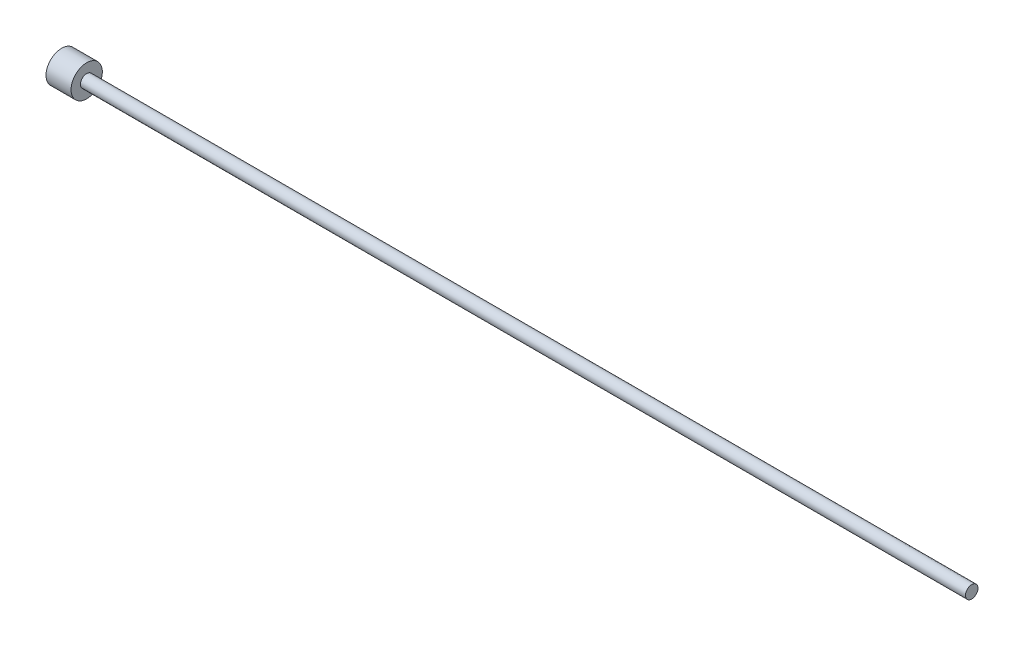
ISO-10303-21;
HEADER;
FILE_DESCRIPTION(('STEP AP214'),'2;1');
FILE_NAME('part.step','',(''),(''),'','','');
FILE_SCHEMA(('AUTOMOTIVE_DESIGN { 1 0 10303 214 1 1 1 1 }'));
ENDSEC;
DATA;
#1=APPLICATION_CONTEXT('core data for automotive mechanical design processes');
#2=APPLICATION_PROTOCOL_DEFINITION('international standard','automotive_design',2000,#1);
#3=PRODUCT_CONTEXT('',#1,'mechanical');
#4=PRODUCT('Part','Part','',(#3));
#5=PRODUCT_RELATED_PRODUCT_CATEGORY('part','',(#4));
#6=PRODUCT_DEFINITION_FORMATION('','',#4);
#7=PRODUCT_DEFINITION_CONTEXT('part definition',#1,'design');
#8=PRODUCT_DEFINITION('design','',#6,#7);
#9=PRODUCT_DEFINITION_SHAPE('','',#8);
#10=(LENGTH_UNIT() NAMED_UNIT(*) SI_UNIT(.MILLI.,.METRE.));
#11=(NAMED_UNIT(*) PLANE_ANGLE_UNIT() SI_UNIT($,.RADIAN.));
#12=(NAMED_UNIT(*) SI_UNIT($,.STERADIAN.) SOLID_ANGLE_UNIT());
#13=UNCERTAINTY_MEASURE_WITH_UNIT(LENGTH_MEASURE(1.E-05),#10,'distance_accuracy_value','');
#14=(GEOMETRIC_REPRESENTATION_CONTEXT(3) GLOBAL_UNCERTAINTY_ASSIGNED_CONTEXT((#13)) GLOBAL_UNIT_ASSIGNED_CONTEXT((#10,
#11,#12)) REPRESENTATION_CONTEXT('',''));
#15=CARTESIAN_POINT('',(0.,0.,0.));
#16=DIRECTION('',(0.,0.,1.));
#17=DIRECTION('',(1.,0.,0.));
#18=AXIS2_PLACEMENT_3D('',#15,#16,#17);
#19=CARTESIAN_POINT('',(0.,0.,0.));
#20=DIRECTION('',(1.,0.,0.));
#21=DIRECTION('',(0.,0.,-1.));
#22=AXIS2_PLACEMENT_3D('',#19,#20,#21);
#23=PLANE('',#22);
#24=CARTESIAN_POINT('',(0.,0.,0.));
#25=DIRECTION('',(-1.,0.,0.));
#26=DIRECTION('',(0.,0.,1.));
#27=AXIS2_PLACEMENT_3D('',#24,#25,#26);
#28=CIRCLE('',#27,12.5);
#29=CARTESIAN_POINT('',(0.,0.,12.5));
#30=VERTEX_POINT('',#29);
#31=EDGE_CURVE('E10',#30,#30,#28,.T.);
#32=ORIENTED_EDGE('',*,*,#31,.T.);
#33=EDGE_LOOP('',(#32));
#34=FACE_BOUND('',#33,.T.);
#35=ADVANCED_FACE('F30',(#34),#23,.F.);
#36=CARTESIAN_POINT('',(0.,0.,0.));
#37=DIRECTION('',(-1.,0.,0.));
#38=DIRECTION('',(0.,0.,1.));
#39=AXIS2_PLACEMENT_3D('',#36,#37,#38);
#40=CYLINDRICAL_SURFACE('',#39,12.5);
#41=ORIENTED_EDGE('',*,*,#31,.F.);
#42=EDGE_LOOP('',(#41));
#43=FACE_BOUND('',#42,.T.);
#44=CARTESIAN_POINT('',(20.,0.,0.));
#45=DIRECTION('',(-1.,0.,0.));
#46=DIRECTION('',(0.,0.,1.));
#47=AXIS2_PLACEMENT_3D('',#44,#45,#46);
#48=CIRCLE('',#47,12.5);
#49=CARTESIAN_POINT('',(20.,0.,12.5));
#50=VERTEX_POINT('',#49);
#51=EDGE_CURVE('E36',#50,#50,#48,.T.);
#52=ORIENTED_EDGE('',*,*,#51,.T.);
#53=EDGE_LOOP('',(#52));
#54=FACE_BOUND('',#53,.T.);
#55=ADVANCED_FACE('F62',(#43,#54),#40,.T.);
#56=CARTESIAN_POINT('',(20.,0.,-12.5));
#57=DIRECTION('',(-1.,0.,0.));
#58=DIRECTION('',(0.,0.,1.));
#59=AXIS2_PLACEMENT_3D('',#56,#57,#58);
#60=PLANE('',#59);
#61=ORIENTED_EDGE('',*,*,#51,.F.);
#62=EDGE_LOOP('',(#61));
#63=FACE_BOUND('',#62,.T.);
#64=CARTESIAN_POINT('',(20.,0.,0.));
#65=DIRECTION('',(-1.,0.,0.));
#66=DIRECTION('',(0.,0.,1.));
#67=AXIS2_PLACEMENT_3D('',#64,#65,#66);
#68=CIRCLE('',#67,5.);
#69=CARTESIAN_POINT('',(20.,0.,5.));
#70=VERTEX_POINT('',#69);
#71=EDGE_CURVE('E40',#70,#70,#68,.T.);
#72=ORIENTED_EDGE('',*,*,#71,.T.);
#73=EDGE_LOOP('',(#72));
#74=FACE_BOUND('',#73,.T.);
#75=ADVANCED_FACE('F58',(#63,#74),#60,.F.);
#76=CARTESIAN_POINT('',(0.,0.,0.));
#77=DIRECTION('',(-1.,0.,0.));
#78=DIRECTION('',(0.,0.,1.));
#79=AXIS2_PLACEMENT_3D('',#76,#77,#78);
#80=CYLINDRICAL_SURFACE('',#79,5.);
#81=ORIENTED_EDGE('',*,*,#71,.F.);
#82=EDGE_LOOP('',(#81));
#83=FACE_BOUND('',#82,.T.);
#84=CARTESIAN_POINT('',(727.,0.,0.));
#85=DIRECTION('',(-1.,0.,0.));
#86=DIRECTION('',(0.,0.,1.));
#87=AXIS2_PLACEMENT_3D('',#84,#85,#86);
#88=CIRCLE('',#87,5.);
#89=CARTESIAN_POINT('',(727.,0.,5.));
#90=VERTEX_POINT('',#89);
#91=EDGE_CURVE('E44',#90,#90,#88,.T.);
#92=ORIENTED_EDGE('',*,*,#91,.T.);
#93=EDGE_LOOP('',(#92));
#94=FACE_BOUND('',#93,.T.);
#95=ADVANCED_FACE('F50',(#83,#94),#80,.T.);
#96=CARTESIAN_POINT('',(727.,0.,-5.));
#97=DIRECTION('',(-1.,0.,0.));
#98=DIRECTION('',(0.,0.,1.));
#99=AXIS2_PLACEMENT_3D('',#96,#97,#98);
#100=PLANE('',#99);
#101=ORIENTED_EDGE('',*,*,#91,.F.);
#102=EDGE_LOOP('',(#101));
#103=FACE_BOUND('',#102,.T.);
#104=ADVANCED_FACE('F52',(#103),#100,.F.);
#105=CLOSED_SHELL('',(#35,#55,#75,#95,#104));
#106=MANIFOLD_SOLID_BREP('B2',#105);
#107=ADVANCED_BREP_SHAPE_REPRESENTATION('',(#18,#106),#14);
#108=SHAPE_DEFINITION_REPRESENTATION(#9,#107);
ENDSEC;
END-ISO-10303-21;
